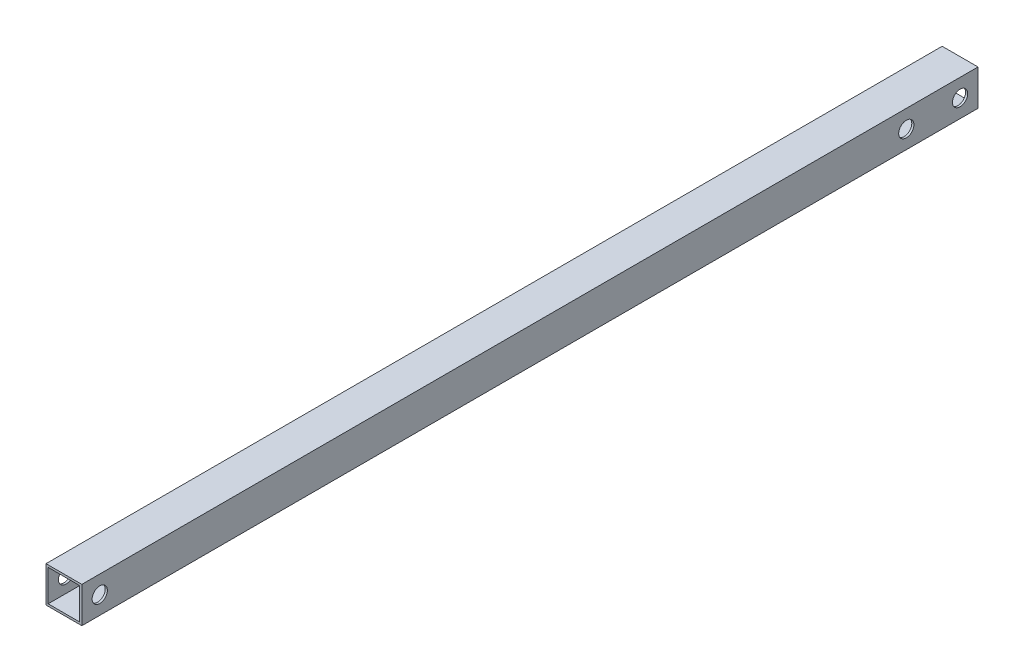
ISO-10303-21;
HEADER;
FILE_DESCRIPTION(('STEP AP214'),'2;1');
FILE_NAME('part.step','',(''),(''),'','','');
FILE_SCHEMA(('AUTOMOTIVE_DESIGN { 1 0 10303 214 1 1 1 1 }'));
ENDSEC;
DATA;
#1=APPLICATION_CONTEXT('core data for automotive mechanical design processes');
#2=APPLICATION_PROTOCOL_DEFINITION('international standard','automotive_design',2000,#1);
#3=PRODUCT_CONTEXT('',#1,'mechanical');
#4=PRODUCT('Part','Part','',(#3));
#5=PRODUCT_RELATED_PRODUCT_CATEGORY('part','',(#4));
#6=PRODUCT_DEFINITION_FORMATION('','',#4);
#7=PRODUCT_DEFINITION_CONTEXT('part definition',#1,'design');
#8=PRODUCT_DEFINITION('design','',#6,#7);
#9=PRODUCT_DEFINITION_SHAPE('','',#8);
#10=(LENGTH_UNIT() NAMED_UNIT(*) SI_UNIT(.MILLI.,.METRE.));
#11=(NAMED_UNIT(*) PLANE_ANGLE_UNIT() SI_UNIT($,.RADIAN.));
#12=(NAMED_UNIT(*) SI_UNIT($,.STERADIAN.) SOLID_ANGLE_UNIT());
#13=UNCERTAINTY_MEASURE_WITH_UNIT(LENGTH_MEASURE(1.E-05),#10,'distance_accuracy_value','');
#14=(GEOMETRIC_REPRESENTATION_CONTEXT(3) GLOBAL_UNCERTAINTY_ASSIGNED_CONTEXT((#13)) GLOBAL_UNIT_ASSIGNED_CONTEXT((#10,
#11,#12)) REPRESENTATION_CONTEXT('',''));
#15=CARTESIAN_POINT('',(0.,0.,0.));
#16=DIRECTION('',(0.,0.,1.));
#17=DIRECTION('',(1.,0.,0.));
#18=AXIS2_PLACEMENT_3D('',#15,#16,#17);
#19=CARTESIAN_POINT('',(0.,0.,500.));
#20=DIRECTION('',(0.,0.,1.));
#21=DIRECTION('',(1.,0.,0.));
#22=AXIS2_PLACEMENT_3D('',#19,#20,#21);
#23=PLANE('',#22);
#24=DIRECTION('',(0.,1.,0.));
#25=VECTOR('',#24,1.);
#26=CARTESIAN_POINT('',(10.,10.,500.));
#27=LINE('',#26,#25);
#28=CARTESIAN_POINT('',(10.,-10.,500.));
#29=VERTEX_POINT('',#28);
#30=CARTESIAN_POINT('',(10.,10.,500.));
#31=VERTEX_POINT('',#30);
#32=EDGE_CURVE('E161',#29,#31,#27,.T.);
#33=ORIENTED_EDGE('',*,*,#32,.T.);
#34=DIRECTION('',(-1.,0.,0.));
#35=VECTOR('',#34,1.);
#36=CARTESIAN_POINT('',(-10.,10.,500.));
#37=LINE('',#36,#35);
#38=CARTESIAN_POINT('',(-10.,10.,500.));
#39=VERTEX_POINT('',#38);
#40=EDGE_CURVE('E165',#31,#39,#37,.T.);
#41=ORIENTED_EDGE('',*,*,#40,.T.);
#42=DIRECTION('',(0.,-1.,0.));
#43=VECTOR('',#42,1.);
#44=CARTESIAN_POINT('',(-10.,10.,500.));
#45=LINE('',#44,#43);
#46=CARTESIAN_POINT('',(-10.,-10.,500.));
#47=VERTEX_POINT('',#46);
#48=EDGE_CURVE('E169',#39,#47,#45,.T.);
#49=ORIENTED_EDGE('',*,*,#48,.T.);
#50=DIRECTION('',(1.,0.,0.));
#51=VECTOR('',#50,1.);
#52=CARTESIAN_POINT('',(-10.,-10.,500.));
#53=LINE('',#52,#51);
#54=EDGE_CURVE('E172',#47,#29,#53,.T.);
#55=ORIENTED_EDGE('',*,*,#54,.T.);
#56=EDGE_LOOP('',(#33,#41,#49,#55));
#57=FACE_BOUND('',#56,.T.);
#58=DIRECTION('',(0.,-1.,0.));
#59=VECTOR('',#58,1.);
#60=CARTESIAN_POINT('',(-8.8,8.8,500.));
#61=LINE('',#60,#59);
#62=CARTESIAN_POINT('',(-8.8,8.8,500.));
#63=VERTEX_POINT('',#62);
#64=CARTESIAN_POINT('',(-8.8,-8.8,500.));
#65=VERTEX_POINT('',#64);
#66=EDGE_CURVE('E120',#63,#65,#61,.T.);
#67=ORIENTED_EDGE('',*,*,#66,.F.);
#68=DIRECTION('',(-1.,0.,0.));
#69=VECTOR('',#68,1.);
#70=CARTESIAN_POINT('',(-8.8,8.8,500.));
#71=LINE('',#70,#69);
#72=CARTESIAN_POINT('',(8.8,8.8,500.));
#73=VERTEX_POINT('',#72);
#74=EDGE_CURVE('E111',#73,#63,#71,.T.);
#75=ORIENTED_EDGE('',*,*,#74,.F.);
#76=DIRECTION('',(0.,1.,0.));
#77=VECTOR('',#76,1.);
#78=CARTESIAN_POINT('',(8.8,8.8,500.));
#79=LINE('',#78,#77);
#80=CARTESIAN_POINT('',(8.8,-8.8,500.));
#81=VERTEX_POINT('',#80);
#82=EDGE_CURVE('E137',#81,#73,#79,.T.);
#83=ORIENTED_EDGE('',*,*,#82,.F.);
#84=DIRECTION('',(1.,0.,0.));
#85=VECTOR('',#84,1.);
#86=CARTESIAN_POINT('',(-8.8,-8.8,500.));
#87=LINE('',#86,#85);
#88=EDGE_CURVE('E133',#65,#81,#87,.T.);
#89=ORIENTED_EDGE('',*,*,#88,.F.);
#90=EDGE_LOOP('',(#67,#75,#83,#89));
#91=FACE_BOUND('',#90,.T.);
#92=ADVANCED_FACE('F43',(#57,#91),#23,.T.);
#93=CARTESIAN_POINT('',(0.,0.,0.));
#94=DIRECTION('',(0.,0.,1.));
#95=DIRECTION('',(1.,0.,0.));
#96=AXIS2_PLACEMENT_3D('',#93,#94,#95);
#97=PLANE('',#96);
#98=DIRECTION('',(0.,1.,0.));
#99=VECTOR('',#98,1.);
#100=CARTESIAN_POINT('',(10.,10.,0.));
#101=LINE('',#100,#99);
#102=CARTESIAN_POINT('',(10.,-10.,0.));
#103=VERTEX_POINT('',#102);
#104=CARTESIAN_POINT('',(10.,10.,0.));
#105=VERTEX_POINT('',#104);
#106=EDGE_CURVE('E129',#103,#105,#101,.T.);
#107=ORIENTED_EDGE('',*,*,#106,.F.);
#108=DIRECTION('',(1.,0.,0.));
#109=VECTOR('',#108,1.);
#110=CARTESIAN_POINT('',(-10.,-10.,0.));
#111=LINE('',#110,#109);
#112=CARTESIAN_POINT('',(-10.,-10.,0.));
#113=VERTEX_POINT('',#112);
#114=EDGE_CURVE('E166',#113,#103,#111,.T.);
#115=ORIENTED_EDGE('',*,*,#114,.F.);
#116=DIRECTION('',(0.,-1.,0.));
#117=VECTOR('',#116,1.);
#118=CARTESIAN_POINT('',(-10.,10.,0.));
#119=LINE('',#118,#117);
#120=CARTESIAN_POINT('',(-10.,10.,0.));
#121=VERTEX_POINT('',#120);
#122=EDGE_CURVE('E182',#121,#113,#119,.T.);
#123=ORIENTED_EDGE('',*,*,#122,.F.);
#124=DIRECTION('',(-1.,0.,0.));
#125=VECTOR('',#124,1.);
#126=CARTESIAN_POINT('',(-10.,10.,0.));
#127=LINE('',#126,#125);
#128=EDGE_CURVE('E179',#105,#121,#127,.T.);
#129=ORIENTED_EDGE('',*,*,#128,.F.);
#130=EDGE_LOOP('',(#107,#115,#123,#129));
#131=FACE_BOUND('',#130,.T.);
#132=DIRECTION('',(-1.,0.,0.));
#133=VECTOR('',#132,1.);
#134=CARTESIAN_POINT('',(-8.8,8.8,0.));
#135=LINE('',#134,#133);
#136=CARTESIAN_POINT('',(8.8,8.8,0.));
#137=VERTEX_POINT('',#136);
#138=CARTESIAN_POINT('',(-8.8,8.8,0.));
#139=VERTEX_POINT('',#138);
#140=EDGE_CURVE('E69',#137,#139,#135,.T.);
#141=ORIENTED_EDGE('',*,*,#140,.T.);
#142=DIRECTION('',(0.,-1.,0.));
#143=VECTOR('',#142,1.);
#144=CARTESIAN_POINT('',(-8.8,8.8,0.));
#145=LINE('',#144,#143);
#146=CARTESIAN_POINT('',(-8.8,-8.8,0.));
#147=VERTEX_POINT('',#146);
#148=EDGE_CURVE('E127',#139,#147,#145,.T.);
#149=ORIENTED_EDGE('',*,*,#148,.T.);
#150=DIRECTION('',(1.,0.,0.));
#151=VECTOR('',#150,1.);
#152=CARTESIAN_POINT('',(-8.8,-8.8,0.));
#153=LINE('',#152,#151);
#154=CARTESIAN_POINT('',(8.8,-8.8,0.));
#155=VERTEX_POINT('',#154);
#156=EDGE_CURVE('E148',#147,#155,#153,.T.);
#157=ORIENTED_EDGE('',*,*,#156,.T.);
#158=DIRECTION('',(0.,1.,0.));
#159=VECTOR('',#158,1.);
#160=CARTESIAN_POINT('',(8.8,8.8,0.));
#161=LINE('',#160,#159);
#162=EDGE_CURVE('E121',#155,#137,#161,.T.);
#163=ORIENTED_EDGE('',*,*,#162,.T.);
#164=EDGE_LOOP('',(#141,#149,#157,#163));
#165=FACE_BOUND('',#164,.T.);
#166=ADVANCED_FACE('F252',(#131,#165),#97,.F.);
#167=CARTESIAN_POINT('',(10.,10.,500.));
#168=DIRECTION('',(-1.,0.,0.));
#169=DIRECTION('',(0.,-1.,0.));
#170=AXIS2_PLACEMENT_3D('',#167,#168,#169);
#171=PLANE('',#170);
#172=CARTESIAN_POINT('',(10.,0.,490.));
#173=DIRECTION('',(1.,0.,0.));
#174=DIRECTION('',(0.,1.,0.));
#175=AXIS2_PLACEMENT_3D('',#172,#173,#174);
#176=CIRCLE('',#175,4.24999999999995);
#177=CARTESIAN_POINT('',(10.,4.24999999999995,490.));
#178=VERTEX_POINT('',#177);
#179=EDGE_CURVE('E201',#178,#178,#176,.T.);
#180=ORIENTED_EDGE('',*,*,#179,.F.);
#181=EDGE_LOOP('',(#180));
#182=FACE_BOUND('',#181,.T.);
#183=CARTESIAN_POINT('',(10.,0.,10.));
#184=DIRECTION('',(1.,0.,0.));
#185=DIRECTION('',(0.,1.,0.));
#186=AXIS2_PLACEMENT_3D('',#183,#184,#185);
#187=CIRCLE('',#186,4.25);
#188=CARTESIAN_POINT('',(10.,4.25,10.));
#189=VERTEX_POINT('',#188);
#190=EDGE_CURVE('E440',#189,#189,#187,.T.);
#191=ORIENTED_EDGE('',*,*,#190,.F.);
#192=EDGE_LOOP('',(#191));
#193=FACE_BOUND('',#192,.T.);
#194=CARTESIAN_POINT('',(10.,0.,40.));
#195=DIRECTION('',(1.,0.,0.));
#196=DIRECTION('',(0.,1.,0.));
#197=AXIS2_PLACEMENT_3D('',#194,#195,#196);
#198=CIRCLE('',#197,4.25000000000001);
#199=CARTESIAN_POINT('',(10.,4.25,40.));
#200=VERTEX_POINT('',#199);
#201=EDGE_CURVE('E443',#200,#200,#198,.T.);
#202=ORIENTED_EDGE('',*,*,#201,.F.);
#203=EDGE_LOOP('',(#202));
#204=FACE_BOUND('',#203,.T.);
#205=ORIENTED_EDGE('',*,*,#106,.T.);
#206=DIRECTION('',(0.,0.,-1.));
#207=VECTOR('',#206,1.);
#208=CARTESIAN_POINT('',(10.,10.,500.));
#209=LINE('',#208,#207);
#210=EDGE_CURVE('E11',#31,#105,#209,.T.);
#211=ORIENTED_EDGE('',*,*,#210,.F.);
#212=ORIENTED_EDGE('',*,*,#32,.F.);
#213=DIRECTION('',(0.,0.,-1.));
#214=VECTOR('',#213,1.);
#215=CARTESIAN_POINT('',(10.,-10.,500.));
#216=LINE('',#215,#214);
#217=EDGE_CURVE('E175',#29,#103,#216,.T.);
#218=ORIENTED_EDGE('',*,*,#217,.T.);
#219=EDGE_LOOP('',(#205,#211,#212,#218));
#220=FACE_BOUND('',#219,.T.);
#221=ADVANCED_FACE('F45',(#182,#193,#204,#220),#171,.F.);
#222=CARTESIAN_POINT('',(-10.,10.,500.));
#223=DIRECTION('',(0.,-1.,0.));
#224=DIRECTION('',(0.,0.,-1.));
#225=AXIS2_PLACEMENT_3D('',#222,#223,#224);
#226=PLANE('',#225);
#227=ORIENTED_EDGE('',*,*,#128,.T.);
#228=DIRECTION('',(0.,0.,-1.));
#229=VECTOR('',#228,1.);
#230=CARTESIAN_POINT('',(-10.,10.,500.));
#231=LINE('',#230,#229);
#232=EDGE_CURVE('E53',#39,#121,#231,.T.);
#233=ORIENTED_EDGE('',*,*,#232,.F.);
#234=ORIENTED_EDGE('',*,*,#40,.F.);
#235=ORIENTED_EDGE('',*,*,#210,.T.);
#236=EDGE_LOOP('',(#227,#233,#234,#235));
#237=FACE_BOUND('',#236,.T.);
#238=ADVANCED_FACE('F268',(#237),#226,.F.);
#239=CARTESIAN_POINT('',(-10.,10.,500.));
#240=DIRECTION('',(1.,0.,0.));
#241=DIRECTION('',(0.,1.,0.));
#242=AXIS2_PLACEMENT_3D('',#239,#240,#241);
#243=PLANE('',#242);
#244=CARTESIAN_POINT('',(-10.,0.,490.));
#245=DIRECTION('',(1.,0.,0.));
#246=DIRECTION('',(0.,1.,0.));
#247=AXIS2_PLACEMENT_3D('',#244,#245,#246);
#248=CIRCLE('',#247,4.24999999999995);
#249=CARTESIAN_POINT('',(-10.,4.24999999999995,490.));
#250=VERTEX_POINT('',#249);
#251=EDGE_CURVE('E145',#250,#250,#248,.T.);
#252=ORIENTED_EDGE('',*,*,#251,.T.);
#253=EDGE_LOOP('',(#252));
#254=FACE_BOUND('',#253,.T.);
#255=CARTESIAN_POINT('',(-10.,0.,10.));
#256=DIRECTION('',(1.,0.,0.));
#257=DIRECTION('',(0.,1.,0.));
#258=AXIS2_PLACEMENT_3D('',#255,#256,#257);
#259=CIRCLE('',#258,4.25);
#260=CARTESIAN_POINT('',(-10.,4.25,10.));
#261=VERTEX_POINT('',#260);
#262=EDGE_CURVE('E212',#261,#261,#259,.T.);
#263=ORIENTED_EDGE('',*,*,#262,.T.);
#264=EDGE_LOOP('',(#263));
#265=FACE_BOUND('',#264,.T.);
#266=CARTESIAN_POINT('',(-10.,0.,40.));
#267=DIRECTION('',(1.,0.,0.));
#268=DIRECTION('',(0.,1.,0.));
#269=AXIS2_PLACEMENT_3D('',#266,#267,#268);
#270=CIRCLE('',#269,4.25000000000001);
#271=CARTESIAN_POINT('',(-10.,4.25,40.));
#272=VERTEX_POINT('',#271);
#273=EDGE_CURVE('E206',#272,#272,#270,.T.);
#274=ORIENTED_EDGE('',*,*,#273,.T.);
#275=EDGE_LOOP('',(#274));
#276=FACE_BOUND('',#275,.T.);
#277=ORIENTED_EDGE('',*,*,#122,.T.);
#278=DIRECTION('',(0.,0.,-1.));
#279=VECTOR('',#278,1.);
#280=CARTESIAN_POINT('',(-10.,-10.,500.));
#281=LINE('',#280,#279);
#282=EDGE_CURVE('E190',#47,#113,#281,.T.);
#283=ORIENTED_EDGE('',*,*,#282,.F.);
#284=ORIENTED_EDGE('',*,*,#48,.F.);
#285=ORIENTED_EDGE('',*,*,#232,.T.);
#286=EDGE_LOOP('',(#277,#283,#284,#285));
#287=FACE_BOUND('',#286,.T.);
#288=ADVANCED_FACE('F233',(#254,#265,#276,#287),#243,.F.);
#289=CARTESIAN_POINT('',(-10.,-10.,500.));
#290=DIRECTION('',(0.,1.,0.));
#291=DIRECTION('',(0.,0.,1.));
#292=AXIS2_PLACEMENT_3D('',#289,#290,#291);
#293=PLANE('',#292);
#294=ORIENTED_EDGE('',*,*,#114,.T.);
#295=ORIENTED_EDGE('',*,*,#217,.F.);
#296=ORIENTED_EDGE('',*,*,#54,.F.);
#297=ORIENTED_EDGE('',*,*,#282,.T.);
#298=EDGE_LOOP('',(#294,#295,#296,#297));
#299=FACE_BOUND('',#298,.T.);
#300=ADVANCED_FACE('F263',(#299),#293,.F.);
#301=CARTESIAN_POINT('',(-8.8,8.8,500.));
#302=DIRECTION('',(0.,-1.,0.));
#303=DIRECTION('',(0.,0.,-1.));
#304=AXIS2_PLACEMENT_3D('',#301,#302,#303);
#305=PLANE('',#304);
#306=ORIENTED_EDGE('',*,*,#140,.F.);
#307=DIRECTION('',(0.,0.,-1.));
#308=VECTOR('',#307,1.);
#309=CARTESIAN_POINT('',(8.8,8.8,500.));
#310=LINE('',#309,#308);
#311=EDGE_CURVE('E115',#73,#137,#310,.T.);
#312=ORIENTED_EDGE('',*,*,#311,.F.);
#313=ORIENTED_EDGE('',*,*,#74,.T.);
#314=DIRECTION('',(0.,0.,-1.));
#315=VECTOR('',#314,1.);
#316=CARTESIAN_POINT('',(-8.8,8.8,500.));
#317=LINE('',#316,#315);
#318=EDGE_CURVE('E114',#63,#139,#317,.T.);
#319=ORIENTED_EDGE('',*,*,#318,.T.);
#320=EDGE_LOOP('',(#306,#312,#313,#319));
#321=FACE_BOUND('',#320,.T.);
#322=ADVANCED_FACE('F113',(#321),#305,.T.);
#323=CARTESIAN_POINT('',(-8.8,8.8,500.));
#324=DIRECTION('',(1.,0.,0.));
#325=DIRECTION('',(0.,1.,0.));
#326=AXIS2_PLACEMENT_3D('',#323,#324,#325);
#327=PLANE('',#326);
#328=CARTESIAN_POINT('',(-8.80000000000003,0.,490.));
#329=DIRECTION('',(1.,0.,0.));
#330=DIRECTION('',(0.,1.,0.));
#331=AXIS2_PLACEMENT_3D('',#328,#329,#330);
#332=CIRCLE('',#331,4.24999999999995);
#333=CARTESIAN_POINT('',(-8.80000000000003,4.24999999999995,490.));
#334=VERTEX_POINT('',#333);
#335=EDGE_CURVE('E226',#334,#334,#332,.T.);
#336=ORIENTED_EDGE('',*,*,#335,.F.);
#337=EDGE_LOOP('',(#336));
#338=FACE_BOUND('',#337,.T.);
#339=CARTESIAN_POINT('',(-8.80000000000003,0.,10.));
#340=DIRECTION('',(1.,0.,0.));
#341=DIRECTION('',(0.,1.,0.));
#342=AXIS2_PLACEMENT_3D('',#339,#340,#341);
#343=CIRCLE('',#342,4.25);
#344=CARTESIAN_POINT('',(-8.80000000000003,4.25,10.));
#345=VERTEX_POINT('',#344);
#346=EDGE_CURVE('E205',#345,#345,#343,.T.);
#347=ORIENTED_EDGE('',*,*,#346,.F.);
#348=EDGE_LOOP('',(#347));
#349=FACE_BOUND('',#348,.T.);
#350=CARTESIAN_POINT('',(-8.80000000000003,0.,40.));
#351=DIRECTION('',(1.,0.,0.));
#352=DIRECTION('',(0.,1.,0.));
#353=AXIS2_PLACEMENT_3D('',#350,#351,#352);
#354=CIRCLE('',#353,4.25000000000001);
#355=CARTESIAN_POINT('',(-8.80000000000003,4.25,40.));
#356=VERTEX_POINT('',#355);
#357=EDGE_CURVE('E200',#356,#356,#354,.T.);
#358=ORIENTED_EDGE('',*,*,#357,.F.);
#359=EDGE_LOOP('',(#358));
#360=FACE_BOUND('',#359,.T.);
#361=ORIENTED_EDGE('',*,*,#148,.F.);
#362=ORIENTED_EDGE('',*,*,#318,.F.);
#363=ORIENTED_EDGE('',*,*,#66,.T.);
#364=DIRECTION('',(0.,0.,-1.));
#365=VECTOR('',#364,1.);
#366=CARTESIAN_POINT('',(-8.8,-8.8,500.));
#367=LINE('',#366,#365);
#368=EDGE_CURVE('E130',#65,#147,#367,.T.);
#369=ORIENTED_EDGE('',*,*,#368,.T.);
#370=EDGE_LOOP('',(#361,#362,#363,#369));
#371=FACE_BOUND('',#370,.T.);
#372=ADVANCED_FACE('F124',(#338,#349,#360,#371),#327,.T.);
#373=CARTESIAN_POINT('',(-8.8,-8.8,500.));
#374=DIRECTION('',(0.,1.,0.));
#375=DIRECTION('',(0.,0.,1.));
#376=AXIS2_PLACEMENT_3D('',#373,#374,#375);
#377=PLANE('',#376);
#378=ORIENTED_EDGE('',*,*,#156,.F.);
#379=ORIENTED_EDGE('',*,*,#368,.F.);
#380=ORIENTED_EDGE('',*,*,#88,.T.);
#381=DIRECTION('',(0.,0.,-1.));
#382=VECTOR('',#381,1.);
#383=CARTESIAN_POINT('',(8.8,-8.8,500.));
#384=LINE('',#383,#382);
#385=EDGE_CURVE('E61',#81,#155,#384,.T.);
#386=ORIENTED_EDGE('',*,*,#385,.T.);
#387=EDGE_LOOP('',(#378,#379,#380,#386));
#388=FACE_BOUND('',#387,.T.);
#389=ADVANCED_FACE('F292',(#388),#377,.T.);
#390=CARTESIAN_POINT('',(8.8,8.8,500.));
#391=DIRECTION('',(-1.,0.,0.));
#392=DIRECTION('',(0.,-1.,0.));
#393=AXIS2_PLACEMENT_3D('',#390,#391,#392);
#394=PLANE('',#393);
#395=CARTESIAN_POINT('',(8.80000000000003,0.,490.));
#396=DIRECTION('',(-1.,0.,0.));
#397=DIRECTION('',(0.,-1.,0.));
#398=AXIS2_PLACEMENT_3D('',#395,#396,#397);
#399=CIRCLE('',#398,4.24999999999995);
#400=CARTESIAN_POINT('',(8.80000000000003,-4.24999999999995,490.));
#401=VERTEX_POINT('',#400);
#402=EDGE_CURVE('E47',#401,#401,#399,.T.);
#403=ORIENTED_EDGE('',*,*,#402,.F.);
#404=EDGE_LOOP('',(#403));
#405=FACE_BOUND('',#404,.T.);
#406=CARTESIAN_POINT('',(8.80000000000003,0.,10.));
#407=DIRECTION('',(-1.,0.,0.));
#408=DIRECTION('',(0.,-1.,0.));
#409=AXIS2_PLACEMENT_3D('',#406,#407,#408);
#410=CIRCLE('',#409,4.25);
#411=CARTESIAN_POINT('',(8.80000000000003,-4.25,10.));
#412=VERTEX_POINT('',#411);
#413=EDGE_CURVE('E202',#412,#412,#410,.T.);
#414=ORIENTED_EDGE('',*,*,#413,.F.);
#415=EDGE_LOOP('',(#414));
#416=FACE_BOUND('',#415,.T.);
#417=CARTESIAN_POINT('',(8.80000000000003,0.,40.));
#418=DIRECTION('',(-1.,0.,0.));
#419=DIRECTION('',(0.,-1.,0.));
#420=AXIS2_PLACEMENT_3D('',#417,#418,#419);
#421=CIRCLE('',#420,4.25000000000001);
#422=CARTESIAN_POINT('',(8.80000000000003,-4.25000000000001,40.));
#423=VERTEX_POINT('',#422);
#424=EDGE_CURVE('E197',#423,#423,#421,.T.);
#425=ORIENTED_EDGE('',*,*,#424,.F.);
#426=EDGE_LOOP('',(#425));
#427=FACE_BOUND('',#426,.T.);
#428=ORIENTED_EDGE('',*,*,#162,.F.);
#429=ORIENTED_EDGE('',*,*,#385,.F.);
#430=ORIENTED_EDGE('',*,*,#82,.T.);
#431=ORIENTED_EDGE('',*,*,#311,.T.);
#432=EDGE_LOOP('',(#428,#429,#430,#431));
#433=FACE_BOUND('',#432,.T.);
#434=ADVANCED_FACE('F289',(#405,#416,#427,#433),#394,.T.);
#435=CARTESIAN_POINT('',(-590.,0.,40.));
#436=DIRECTION('',(1.,0.,0.));
#437=DIRECTION('',(0.,1.,0.));
#438=AXIS2_PLACEMENT_3D('',#435,#436,#437);
#439=CYLINDRICAL_SURFACE('',#438,4.25000000000001);
#440=ORIENTED_EDGE('',*,*,#424,.T.);
#441=EDGE_LOOP('',(#440));
#442=FACE_BOUND('',#441,.T.);
#443=ORIENTED_EDGE('',*,*,#201,.T.);
#444=EDGE_LOOP('',(#443));
#445=FACE_BOUND('',#444,.T.);
#446=ADVANCED_FACE('F291',(#442,#445),#439,.F.);
#447=CARTESIAN_POINT('',(-590.,0.,10.));
#448=DIRECTION('',(1.,0.,0.));
#449=DIRECTION('',(0.,1.,0.));
#450=AXIS2_PLACEMENT_3D('',#447,#448,#449);
#451=CYLINDRICAL_SURFACE('',#450,4.25);
#452=ORIENTED_EDGE('',*,*,#413,.T.);
#453=EDGE_LOOP('',(#452));
#454=FACE_BOUND('',#453,.T.);
#455=ORIENTED_EDGE('',*,*,#190,.T.);
#456=EDGE_LOOP('',(#455));
#457=FACE_BOUND('',#456,.T.);
#458=ADVANCED_FACE('F248',(#454,#457),#451,.F.);
#459=CARTESIAN_POINT('',(-590.,0.,490.));
#460=DIRECTION('',(1.,0.,0.));
#461=DIRECTION('',(0.,1.,0.));
#462=AXIS2_PLACEMENT_3D('',#459,#460,#461);
#463=CYLINDRICAL_SURFACE('',#462,4.24999999999995);
#464=ORIENTED_EDGE('',*,*,#402,.T.);
#465=EDGE_LOOP('',(#464));
#466=FACE_BOUND('',#465,.T.);
#467=ORIENTED_EDGE('',*,*,#179,.T.);
#468=EDGE_LOOP('',(#467));
#469=FACE_BOUND('',#468,.T.);
#470=ADVANCED_FACE('F241',(#466,#469),#463,.F.);
#471=ORIENTED_EDGE('',*,*,#357,.T.);
#472=EDGE_LOOP('',(#471));
#473=FACE_BOUND('',#472,.T.);
#474=ORIENTED_EDGE('',*,*,#273,.F.);
#475=EDGE_LOOP('',(#474));
#476=FACE_BOUND('',#475,.T.);
#477=ADVANCED_FACE('F245',(#473,#476),#439,.F.);
#478=ORIENTED_EDGE('',*,*,#346,.T.);
#479=EDGE_LOOP('',(#478));
#480=FACE_BOUND('',#479,.T.);
#481=ORIENTED_EDGE('',*,*,#262,.F.);
#482=EDGE_LOOP('',(#481));
#483=FACE_BOUND('',#482,.T.);
#484=ADVANCED_FACE('F238',(#480,#483),#451,.F.);
#485=ORIENTED_EDGE('',*,*,#335,.T.);
#486=EDGE_LOOP('',(#485));
#487=FACE_BOUND('',#486,.T.);
#488=ORIENTED_EDGE('',*,*,#251,.F.);
#489=EDGE_LOOP('',(#488));
#490=FACE_BOUND('',#489,.T.);
#491=ADVANCED_FACE('F236',(#487,#490),#463,.F.);
#492=CLOSED_SHELL('',(#92,#166,#221,#238,#288,#300,#322,#372,#389,#434,#446,#458,#470,#477,#484,#491));
#493=MANIFOLD_SOLID_BREP('B2',#492);
#494=ADVANCED_BREP_SHAPE_REPRESENTATION('',(#18,#493),#14);
#495=SHAPE_DEFINITION_REPRESENTATION(#9,#494);
ENDSEC;
END-ISO-10303-21;
